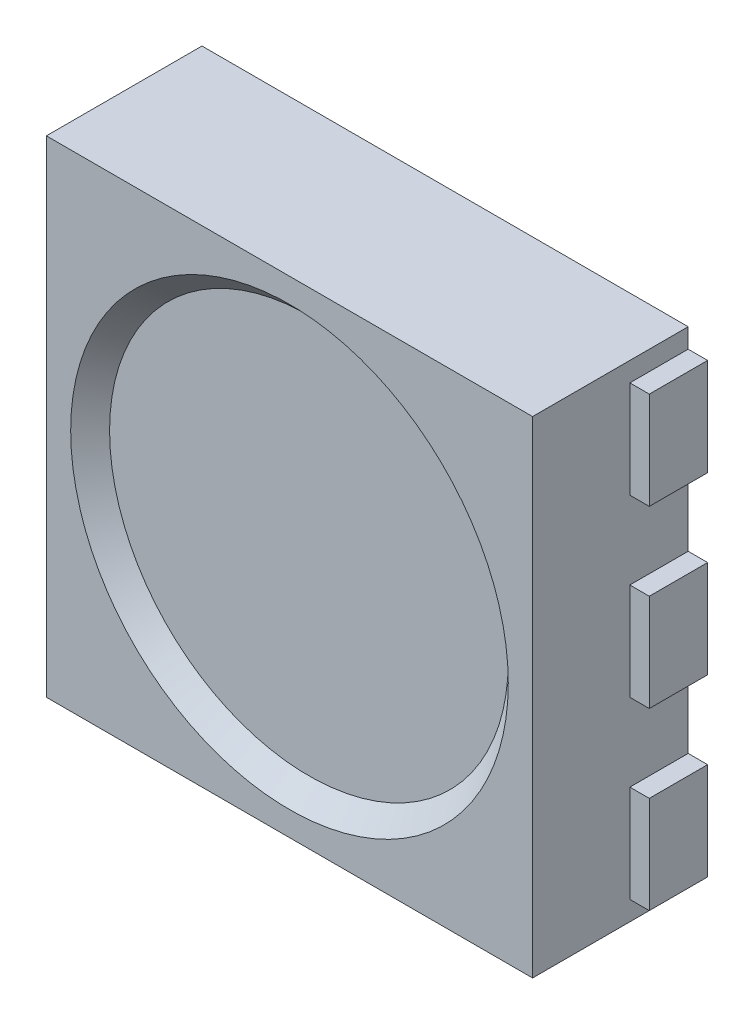
ISO-10303-21;
HEADER;
FILE_DESCRIPTION(('STEP AP214'),'2;1');
FILE_NAME('part.step','',(''),(''),'','','');
FILE_SCHEMA(('AUTOMOTIVE_DESIGN { 1 0 10303 214 1 1 1 1 }'));
ENDSEC;
DATA;
#1=APPLICATION_CONTEXT('core data for automotive mechanical design processes');
#2=APPLICATION_PROTOCOL_DEFINITION('international standard','automotive_design',2000,#1);
#3=PRODUCT_CONTEXT('',#1,'mechanical');
#4=PRODUCT('Part','Part','',(#3));
#5=PRODUCT_RELATED_PRODUCT_CATEGORY('part','',(#4));
#6=PRODUCT_DEFINITION_FORMATION('','',#4);
#7=PRODUCT_DEFINITION_CONTEXT('part definition',#1,'design');
#8=PRODUCT_DEFINITION('design','',#6,#7);
#9=PRODUCT_DEFINITION_SHAPE('','',#8);
#10=(LENGTH_UNIT() NAMED_UNIT(*) SI_UNIT(.MILLI.,.METRE.));
#11=(NAMED_UNIT(*) PLANE_ANGLE_UNIT() SI_UNIT($,.RADIAN.));
#12=(NAMED_UNIT(*) SI_UNIT($,.STERADIAN.) SOLID_ANGLE_UNIT());
#13=UNCERTAINTY_MEASURE_WITH_UNIT(LENGTH_MEASURE(1.E-05),#10,'distance_accuracy_value','');
#14=(GEOMETRIC_REPRESENTATION_CONTEXT(3) GLOBAL_UNCERTAINTY_ASSIGNED_CONTEXT((#13)) GLOBAL_UNIT_ASSIGNED_CONTEXT((#10,
#11,#12)) REPRESENTATION_CONTEXT('',''));
#15=CARTESIAN_POINT('',(0.,0.,0.));
#16=DIRECTION('',(0.,0.,1.));
#17=DIRECTION('',(1.,0.,0.));
#18=AXIS2_PLACEMENT_3D('',#15,#16,#17);
#19=CARTESIAN_POINT('',(2.5,2.5,1.6));
#20=DIRECTION('',(-1.,0.,0.));
#21=DIRECTION('',(0.,-1.,0.));
#22=AXIS2_PLACEMENT_3D('',#19,#20,#21);
#23=PLANE('',#22);
#24=DIRECTION('',(0.,0.,-1.));
#25=VECTOR('',#24,1.);
#26=CARTESIAN_POINT('',(2.5,0.5,0.6));
#27=LINE('',#26,#25);
#28=CARTESIAN_POINT('',(2.5,0.5,0.6));
#29=VERTEX_POINT('',#28);
#30=CARTESIAN_POINT('',(2.5,0.5,0.));
#31=VERTEX_POINT('',#30);
#32=EDGE_CURVE('E247',#29,#31,#27,.T.);
#33=ORIENTED_EDGE('',*,*,#32,.T.);
#34=DIRECTION('',(0.,1.,0.));
#35=VECTOR('',#34,1.);
#36=CARTESIAN_POINT('',(2.5,2.5,0.));
#37=LINE('',#36,#35);
#38=CARTESIAN_POINT('',(2.5,1.3,0.));
#39=VERTEX_POINT('',#38);
#40=EDGE_CURVE('E413',#31,#39,#37,.T.);
#41=ORIENTED_EDGE('',*,*,#40,.T.);
#42=DIRECTION('',(0.,0.,-1.));
#43=VECTOR('',#42,1.);
#44=CARTESIAN_POINT('',(2.5,1.3,0.6));
#45=LINE('',#44,#43);
#46=CARTESIAN_POINT('',(2.5,1.3,0.6));
#47=VERTEX_POINT('',#46);
#48=EDGE_CURVE('E358',#47,#39,#45,.T.);
#49=ORIENTED_EDGE('',*,*,#48,.F.);
#50=DIRECTION('',(0.,-1.,0.));
#51=VECTOR('',#50,1.);
#52=CARTESIAN_POINT('',(2.5,2.3,0.6));
#53=LINE('',#52,#51);
#54=CARTESIAN_POINT('',(2.5,2.3,0.6));
#55=VERTEX_POINT('',#54);
#56=EDGE_CURVE('E341',#55,#47,#53,.T.);
#57=ORIENTED_EDGE('',*,*,#56,.F.);
#58=DIRECTION('',(0.,0.,-1.));
#59=VECTOR('',#58,1.);
#60=CARTESIAN_POINT('',(2.5,2.3,0.6));
#61=LINE('',#60,#59);
#62=CARTESIAN_POINT('',(2.5,2.3,0.));
#63=VERTEX_POINT('',#62);
#64=EDGE_CURVE('E361',#55,#63,#61,.T.);
#65=ORIENTED_EDGE('',*,*,#64,.T.);
#66=CARTESIAN_POINT('',(2.5,2.5,0.));
#67=VERTEX_POINT('',#66);
#68=EDGE_CURVE('E397',#63,#67,#37,.T.);
#69=ORIENTED_EDGE('',*,*,#68,.T.);
#70=DIRECTION('',(0.,0.,-1.));
#71=VECTOR('',#70,1.);
#72=CARTESIAN_POINT('',(2.5,2.5,1.6));
#73=LINE('',#72,#71);
#74=CARTESIAN_POINT('',(2.5,2.5,1.6));
#75=VERTEX_POINT('',#74);
#76=EDGE_CURVE('E11',#75,#67,#73,.T.);
#77=ORIENTED_EDGE('',*,*,#76,.F.);
#78=DIRECTION('',(0.,1.,0.));
#79=VECTOR('',#78,1.);
#80=CARTESIAN_POINT('',(2.5,2.5,1.6));
#81=LINE('',#80,#79);
#82=CARTESIAN_POINT('',(2.5,-2.5,1.6));
#83=VERTEX_POINT('',#82);
#84=EDGE_CURVE('E398',#83,#75,#81,.T.);
#85=ORIENTED_EDGE('',*,*,#84,.F.);
#86=DIRECTION('',(0.,0.,-1.));
#87=VECTOR('',#86,1.);
#88=CARTESIAN_POINT('',(2.5,-2.5,1.6));
#89=LINE('',#88,#87);
#90=CARTESIAN_POINT('',(2.5,-2.5,0.));
#91=VERTEX_POINT('',#90);
#92=EDGE_CURVE('E408',#83,#91,#89,.T.);
#93=ORIENTED_EDGE('',*,*,#92,.T.);
#94=CARTESIAN_POINT('',(2.5,-2.3,0.));
#95=VERTEX_POINT('',#94);
#96=EDGE_CURVE('E409',#91,#95,#37,.T.);
#97=ORIENTED_EDGE('',*,*,#96,.T.);
#98=DIRECTION('',(0.,0.,-1.));
#99=VECTOR('',#98,1.);
#100=CARTESIAN_POINT('',(2.5,-2.3,0.6));
#101=LINE('',#100,#99);
#102=CARTESIAN_POINT('',(2.5,-2.3,0.6));
#103=VERTEX_POINT('',#102);
#104=EDGE_CURVE('E335',#103,#95,#101,.T.);
#105=ORIENTED_EDGE('',*,*,#104,.F.);
#106=DIRECTION('',(0.,-1.,0.));
#107=VECTOR('',#106,1.);
#108=CARTESIAN_POINT('',(2.5,-2.3,0.6));
#109=LINE('',#108,#107);
#110=CARTESIAN_POINT('',(2.5,-1.3,0.6));
#111=VERTEX_POINT('',#110);
#112=EDGE_CURVE('E310',#111,#103,#109,.T.);
#113=ORIENTED_EDGE('',*,*,#112,.F.);
#114=DIRECTION('',(0.,0.,-1.));
#115=VECTOR('',#114,1.);
#116=CARTESIAN_POINT('',(2.5,-1.3,0.6));
#117=LINE('',#116,#115);
#118=CARTESIAN_POINT('',(2.5,-1.3,0.));
#119=VERTEX_POINT('',#118);
#120=EDGE_CURVE('E321',#111,#119,#117,.T.);
#121=ORIENTED_EDGE('',*,*,#120,.T.);
#122=CARTESIAN_POINT('',(2.5,-0.5,0.));
#123=VERTEX_POINT('',#122);
#124=EDGE_CURVE('E412',#119,#123,#37,.T.);
#125=ORIENTED_EDGE('',*,*,#124,.T.);
#126=DIRECTION('',(0.,0.,-1.));
#127=VECTOR('',#126,1.);
#128=CARTESIAN_POINT('',(2.5,-0.5,0.6));
#129=LINE('',#128,#127);
#130=CARTESIAN_POINT('',(2.5,-0.5,0.6));
#131=VERTEX_POINT('',#130);
#132=EDGE_CURVE('E52',#131,#123,#129,.T.);
#133=ORIENTED_EDGE('',*,*,#132,.F.);
#134=DIRECTION('',(0.,-1.,0.));
#135=VECTOR('',#134,1.);
#136=CARTESIAN_POINT('',(2.5,0.5,0.6));
#137=LINE('',#136,#135);
#138=EDGE_CURVE('E47',#29,#131,#137,.T.);
#139=ORIENTED_EDGE('',*,*,#138,.F.);
#140=EDGE_LOOP('',(#33,#41,#49,#57,#65,#69,#77,#85,#93,#97,#105,#113,#121,#125,#133,#139));
#141=FACE_BOUND('',#140,.T.);
#142=ADVANCED_FACE('F33',(#141),#23,.F.);
#143=CARTESIAN_POINT('',(-2.5,2.5,1.6));
#144=DIRECTION('',(1.,0.,0.));
#145=DIRECTION('',(0.,1.,0.));
#146=AXIS2_PLACEMENT_3D('',#143,#144,#145);
#147=PLANE('',#146);
#148=DIRECTION('',(0.,0.,-1.));
#149=VECTOR('',#148,1.);
#150=CARTESIAN_POINT('',(-2.5,-0.5,0.6));
#151=LINE('',#150,#149);
#152=CARTESIAN_POINT('',(-2.5,-0.5,0.6));
#153=VERTEX_POINT('',#152);
#154=CARTESIAN_POINT('',(-2.5,-0.5,0.));
#155=VERTEX_POINT('',#154);
#156=EDGE_CURVE('E274',#153,#155,#151,.T.);
#157=ORIENTED_EDGE('',*,*,#156,.T.);
#158=DIRECTION('',(0.,-1.,0.));
#159=VECTOR('',#158,1.);
#160=CARTESIAN_POINT('',(-2.5,2.5,0.));
#161=LINE('',#160,#159);
#162=CARTESIAN_POINT('',(-2.5,-1.3,0.));
#163=VERTEX_POINT('',#162);
#164=EDGE_CURVE('E420',#155,#163,#161,.T.);
#165=ORIENTED_EDGE('',*,*,#164,.T.);
#166=DIRECTION('',(0.,0.,-1.));
#167=VECTOR('',#166,1.);
#168=CARTESIAN_POINT('',(-2.5,-1.3,0.6));
#169=LINE('',#168,#167);
#170=CARTESIAN_POINT('',(-2.5,-1.3,0.6));
#171=VERTEX_POINT('',#170);
#172=EDGE_CURVE('E303',#171,#163,#169,.T.);
#173=ORIENTED_EDGE('',*,*,#172,.F.);
#174=DIRECTION('',(0.,1.,0.));
#175=VECTOR('',#174,1.);
#176=CARTESIAN_POINT('',(-2.5,-2.3,0.6));
#177=LINE('',#176,#175);
#178=CARTESIAN_POINT('',(-2.5,-2.3,0.6));
#179=VERTEX_POINT('',#178);
#180=EDGE_CURVE('E284',#179,#171,#177,.T.);
#181=ORIENTED_EDGE('',*,*,#180,.F.);
#182=DIRECTION('',(0.,0.,-1.));
#183=VECTOR('',#182,1.);
#184=CARTESIAN_POINT('',(-2.5,-2.3,0.6));
#185=LINE('',#184,#183);
#186=CARTESIAN_POINT('',(-2.5,-2.3,0.));
#187=VERTEX_POINT('',#186);
#188=EDGE_CURVE('E306',#179,#187,#185,.T.);
#189=ORIENTED_EDGE('',*,*,#188,.T.);
#190=CARTESIAN_POINT('',(-2.5,-2.5,0.));
#191=VERTEX_POINT('',#190);
#192=EDGE_CURVE('E415',#187,#191,#161,.T.);
#193=ORIENTED_EDGE('',*,*,#192,.T.);
#194=DIRECTION('',(0.,0.,-1.));
#195=VECTOR('',#194,1.);
#196=CARTESIAN_POINT('',(-2.5,-2.5,1.6));
#197=LINE('',#196,#195);
#198=CARTESIAN_POINT('',(-2.5,-2.5,1.6));
#199=VERTEX_POINT('',#198);
#200=EDGE_CURVE('E424',#199,#191,#197,.T.);
#201=ORIENTED_EDGE('',*,*,#200,.F.);
#202=DIRECTION('',(0.,-1.,0.));
#203=VECTOR('',#202,1.);
#204=CARTESIAN_POINT('',(-2.5,2.5,1.6));
#205=LINE('',#204,#203);
#206=CARTESIAN_POINT('',(-2.5,2.5,1.6));
#207=VERTEX_POINT('',#206);
#208=EDGE_CURVE('E404',#207,#199,#205,.T.);
#209=ORIENTED_EDGE('',*,*,#208,.F.);
#210=DIRECTION('',(0.,0.,-1.));
#211=VECTOR('',#210,1.);
#212=CARTESIAN_POINT('',(-2.5,2.5,1.6));
#213=LINE('',#212,#211);
#214=CARTESIAN_POINT('',(-2.5,2.5,0.));
#215=VERTEX_POINT('',#214);
#216=EDGE_CURVE('E40',#207,#215,#213,.T.);
#217=ORIENTED_EDGE('',*,*,#216,.T.);
#218=CARTESIAN_POINT('',(-2.5,2.3,0.));
#219=VERTEX_POINT('',#218);
#220=EDGE_CURVE('E416',#215,#219,#161,.T.);
#221=ORIENTED_EDGE('',*,*,#220,.T.);
#222=DIRECTION('',(0.,0.,-1.));
#223=VECTOR('',#222,1.);
#224=CARTESIAN_POINT('',(-2.5,2.3,0.6));
#225=LINE('',#224,#223);
#226=CARTESIAN_POINT('',(-2.5,2.3,0.6));
#227=VERTEX_POINT('',#226);
#228=EDGE_CURVE('E388',#227,#219,#225,.T.);
#229=ORIENTED_EDGE('',*,*,#228,.F.);
#230=DIRECTION('',(0.,1.,0.));
#231=VECTOR('',#230,1.);
#232=CARTESIAN_POINT('',(-2.5,2.3,0.6));
#233=LINE('',#232,#231);
#234=CARTESIAN_POINT('',(-2.5,1.3,0.6));
#235=VERTEX_POINT('',#234);
#236=EDGE_CURVE('E365',#235,#227,#233,.T.);
#237=ORIENTED_EDGE('',*,*,#236,.F.);
#238=DIRECTION('',(0.,0.,-1.));
#239=VECTOR('',#238,1.);
#240=CARTESIAN_POINT('',(-2.5,1.3,0.6));
#241=LINE('',#240,#239);
#242=CARTESIAN_POINT('',(-2.5,1.3,0.));
#243=VERTEX_POINT('',#242);
#244=EDGE_CURVE('E375',#235,#243,#241,.T.);
#245=ORIENTED_EDGE('',*,*,#244,.T.);
#246=CARTESIAN_POINT('',(-2.5,0.5,0.));
#247=VERTEX_POINT('',#246);
#248=EDGE_CURVE('E419',#243,#247,#161,.T.);
#249=ORIENTED_EDGE('',*,*,#248,.T.);
#250=DIRECTION('',(0.,0.,-1.));
#251=VECTOR('',#250,1.);
#252=CARTESIAN_POINT('',(-2.5,0.5,0.6));
#253=LINE('',#252,#251);
#254=CARTESIAN_POINT('',(-2.5,0.5,0.6));
#255=VERTEX_POINT('',#254);
#256=EDGE_CURVE('E271',#255,#247,#253,.T.);
#257=ORIENTED_EDGE('',*,*,#256,.F.);
#258=DIRECTION('',(0.,1.,0.));
#259=VECTOR('',#258,1.);
#260=CARTESIAN_POINT('',(-2.5,0.5,0.6));
#261=LINE('',#260,#259);
#262=EDGE_CURVE('E257',#153,#255,#261,.T.);
#263=ORIENTED_EDGE('',*,*,#262,.F.);
#264=EDGE_LOOP('',(#157,#165,#173,#181,#189,#193,#201,#209,#217,#221,#229,#237,#245,#249,#257,#263));
#265=FACE_BOUND('',#264,.T.);
#266=ADVANCED_FACE('F431',(#265),#147,.F.);
#267=CARTESIAN_POINT('',(-2.5,2.5,1.6));
#268=DIRECTION('',(0.,-1.,0.));
#269=DIRECTION('',(0.,0.,-1.));
#270=AXIS2_PLACEMENT_3D('',#267,#268,#269);
#271=PLANE('',#270);
#272=DIRECTION('',(-1.,0.,0.));
#273=VECTOR('',#272,1.);
#274=CARTESIAN_POINT('',(-2.5,2.5,0.));
#275=LINE('',#274,#273);
#276=EDGE_CURVE('E411',#67,#215,#275,.T.);
#277=ORIENTED_EDGE('',*,*,#276,.T.);
#278=ORIENTED_EDGE('',*,*,#216,.F.);
#279=DIRECTION('',(-1.,0.,0.));
#280=VECTOR('',#279,1.);
#281=CARTESIAN_POINT('',(-2.5,2.5,1.6));
#282=LINE('',#281,#280);
#283=EDGE_CURVE('E401',#75,#207,#282,.T.);
#284=ORIENTED_EDGE('',*,*,#283,.F.);
#285=ORIENTED_EDGE('',*,*,#76,.T.);
#286=EDGE_LOOP('',(#277,#278,#284,#285));
#287=FACE_BOUND('',#286,.T.);
#288=ADVANCED_FACE('F471',(#287),#271,.F.);
#289=CARTESIAN_POINT('',(-2.5,-2.5,1.6));
#290=DIRECTION('',(0.,1.,0.));
#291=DIRECTION('',(0.,0.,1.));
#292=AXIS2_PLACEMENT_3D('',#289,#290,#291);
#293=PLANE('',#292);
#294=DIRECTION('',(1.,0.,0.));
#295=VECTOR('',#294,1.);
#296=CARTESIAN_POINT('',(-2.5,-2.5,0.));
#297=LINE('',#296,#295);
#298=EDGE_CURVE('E402',#191,#91,#297,.T.);
#299=ORIENTED_EDGE('',*,*,#298,.T.);
#300=ORIENTED_EDGE('',*,*,#92,.F.);
#301=DIRECTION('',(1.,0.,0.));
#302=VECTOR('',#301,1.);
#303=CARTESIAN_POINT('',(-2.5,-2.5,1.6));
#304=LINE('',#303,#302);
#305=EDGE_CURVE('E406',#199,#83,#304,.T.);
#306=ORIENTED_EDGE('',*,*,#305,.F.);
#307=ORIENTED_EDGE('',*,*,#200,.T.);
#308=EDGE_LOOP('',(#299,#300,#306,#307));
#309=FACE_BOUND('',#308,.T.);
#310=ADVANCED_FACE('F462',(#309),#293,.F.);
#311=CARTESIAN_POINT('',(0.,0.,1.6));
#312=DIRECTION('',(0.,0.,1.));
#313=DIRECTION('',(1.,0.,0.));
#314=AXIS2_PLACEMENT_3D('',#311,#312,#313);
#315=PLANE('',#314);
#316=CARTESIAN_POINT('',(0.,0.,1.6));
#317=DIRECTION('',(0.,0.,1.));
#318=DIRECTION('',(1.,0.,0.));
#319=AXIS2_PLACEMENT_3D('',#316,#317,#318);
#320=CIRCLE('',#319,2.25);
#321=CARTESIAN_POINT('',(2.25,0.,1.6));
#322=VERTEX_POINT('',#321);
#323=EDGE_CURVE('E391',#322,#322,#320,.T.);
#324=ORIENTED_EDGE('',*,*,#323,.F.);
#325=EDGE_LOOP('',(#324));
#326=FACE_BOUND('',#325,.T.);
#327=ORIENTED_EDGE('',*,*,#84,.T.);
#328=ORIENTED_EDGE('',*,*,#283,.T.);
#329=ORIENTED_EDGE('',*,*,#208,.T.);
#330=ORIENTED_EDGE('',*,*,#305,.T.);
#331=EDGE_LOOP('',(#327,#328,#329,#330));
#332=FACE_BOUND('',#331,.T.);
#333=ADVANCED_FACE('F470',(#326,#332),#315,.T.);
#334=CARTESIAN_POINT('',(0.,0.,0.));
#335=DIRECTION('',(0.,0.,1.));
#336=DIRECTION('',(1.,0.,0.));
#337=AXIS2_PLACEMENT_3D('',#334,#335,#336);
#338=PLANE('',#337);
#339=ORIENTED_EDGE('',*,*,#96,.F.);
#340=ORIENTED_EDGE('',*,*,#298,.F.);
#341=ORIENTED_EDGE('',*,*,#192,.F.);
#342=DIRECTION('',(1.,0.,0.));
#343=VECTOR('',#342,1.);
#344=CARTESIAN_POINT('',(-2.5,-2.3,0.));
#345=LINE('',#344,#343);
#346=CARTESIAN_POINT('',(-2.7,-2.3,0.));
#347=VERTEX_POINT('',#346);
#348=EDGE_CURVE('E280',#347,#187,#345,.T.);
#349=ORIENTED_EDGE('',*,*,#348,.F.);
#350=DIRECTION('',(0.,-1.,0.));
#351=VECTOR('',#350,1.);
#352=CARTESIAN_POINT('',(-2.7,-2.3,0.));
#353=LINE('',#352,#351);
#354=CARTESIAN_POINT('',(-2.7,-1.3,0.));
#355=VERTEX_POINT('',#354);
#356=EDGE_CURVE('E285',#355,#347,#353,.T.);
#357=ORIENTED_EDGE('',*,*,#356,.F.);
#358=DIRECTION('',(-1.,0.,0.));
#359=VECTOR('',#358,1.);
#360=CARTESIAN_POINT('',(-2.5,-1.3,0.));
#361=LINE('',#360,#359);
#362=EDGE_CURVE('E295',#163,#355,#361,.T.);
#363=ORIENTED_EDGE('',*,*,#362,.F.);
#364=ORIENTED_EDGE('',*,*,#164,.F.);
#365=DIRECTION('',(1.,0.,0.));
#366=VECTOR('',#365,1.);
#367=CARTESIAN_POINT('',(-2.7,-0.5,0.));
#368=LINE('',#367,#366);
#369=CARTESIAN_POINT('',(-2.7,-0.5,0.));
#370=VERTEX_POINT('',#369);
#371=EDGE_CURVE('E265',#370,#155,#368,.T.);
#372=ORIENTED_EDGE('',*,*,#371,.F.);
#373=DIRECTION('',(0.,-1.,0.));
#374=VECTOR('',#373,1.);
#375=CARTESIAN_POINT('',(-2.7,0.5,0.));
#376=LINE('',#375,#374);
#377=CARTESIAN_POINT('',(-2.7,0.5,0.));
#378=VERTEX_POINT('',#377);
#379=EDGE_CURVE('E249',#378,#370,#376,.T.);
#380=ORIENTED_EDGE('',*,*,#379,.F.);
#381=DIRECTION('',(-1.,0.,0.));
#382=VECTOR('',#381,1.);
#383=CARTESIAN_POINT('',(-2.7,0.5,0.));
#384=LINE('',#383,#382);
#385=EDGE_CURVE('E254',#247,#378,#384,.T.);
#386=ORIENTED_EDGE('',*,*,#385,.F.);
#387=ORIENTED_EDGE('',*,*,#248,.F.);
#388=DIRECTION('',(1.,0.,0.));
#389=VECTOR('',#388,1.);
#390=CARTESIAN_POINT('',(-2.5,1.3,0.));
#391=LINE('',#390,#389);
#392=CARTESIAN_POINT('',(-2.7,1.3,0.));
#393=VERTEX_POINT('',#392);
#394=EDGE_CURVE('E369',#393,#243,#391,.T.);
#395=ORIENTED_EDGE('',*,*,#394,.F.);
#396=DIRECTION('',(0.,-1.,0.));
#397=VECTOR('',#396,1.);
#398=CARTESIAN_POINT('',(-2.7,2.3,0.));
#399=LINE('',#398,#397);
#400=CARTESIAN_POINT('',(-2.7,2.3,0.));
#401=VERTEX_POINT('',#400);
#402=EDGE_CURVE('E377',#401,#393,#399,.T.);
#403=ORIENTED_EDGE('',*,*,#402,.F.);
#404=DIRECTION('',(-1.,0.,0.));
#405=VECTOR('',#404,1.);
#406=CARTESIAN_POINT('',(-2.5,2.3,0.));
#407=LINE('',#406,#405);
#408=EDGE_CURVE('E364',#219,#401,#407,.T.);
#409=ORIENTED_EDGE('',*,*,#408,.F.);
#410=ORIENTED_EDGE('',*,*,#220,.F.);
#411=ORIENTED_EDGE('',*,*,#276,.F.);
#412=ORIENTED_EDGE('',*,*,#68,.F.);
#413=DIRECTION('',(-1.,0.,0.));
#414=VECTOR('',#413,1.);
#415=CARTESIAN_POINT('',(2.5,2.3,0.));
#416=LINE('',#415,#414);
#417=CARTESIAN_POINT('',(2.7,2.3,0.));
#418=VERTEX_POINT('',#417);
#419=EDGE_CURVE('E338',#418,#63,#416,.T.);
#420=ORIENTED_EDGE('',*,*,#419,.F.);
#421=DIRECTION('',(0.,1.,0.));
#422=VECTOR('',#421,1.);
#423=CARTESIAN_POINT('',(2.7,2.3,0.));
#424=LINE('',#423,#422);
#425=CARTESIAN_POINT('',(2.7,1.3,0.));
#426=VERTEX_POINT('',#425);
#427=EDGE_CURVE('E342',#426,#418,#424,.T.);
#428=ORIENTED_EDGE('',*,*,#427,.F.);
#429=DIRECTION('',(1.,0.,0.));
#430=VECTOR('',#429,1.);
#431=CARTESIAN_POINT('',(2.5,1.3,0.));
#432=LINE('',#431,#430);
#433=EDGE_CURVE('E350',#39,#426,#432,.T.);
#434=ORIENTED_EDGE('',*,*,#433,.F.);
#435=ORIENTED_EDGE('',*,*,#40,.F.);
#436=DIRECTION('',(-1.,0.,0.));
#437=VECTOR('',#436,1.);
#438=CARTESIAN_POINT('',(2.7,0.5,0.));
#439=LINE('',#438,#437);
#440=CARTESIAN_POINT('',(2.7,0.5,0.));
#441=VERTEX_POINT('',#440);
#442=EDGE_CURVE('E239',#441,#31,#439,.T.);
#443=ORIENTED_EDGE('',*,*,#442,.F.);
#444=DIRECTION('',(0.,1.,0.));
#445=VECTOR('',#444,1.);
#446=CARTESIAN_POINT('',(2.7,0.5,0.));
#447=LINE('',#446,#445);
#448=CARTESIAN_POINT('',(2.7,-0.5,0.));
#449=VERTEX_POINT('',#448);
#450=EDGE_CURVE('E243',#449,#441,#447,.T.);
#451=ORIENTED_EDGE('',*,*,#450,.F.);
#452=DIRECTION('',(1.,0.,0.));
#453=VECTOR('',#452,1.);
#454=CARTESIAN_POINT('',(2.7,-0.5,0.));
#455=LINE('',#454,#453);
#456=EDGE_CURVE('E227',#123,#449,#455,.T.);
#457=ORIENTED_EDGE('',*,*,#456,.F.);
#458=ORIENTED_EDGE('',*,*,#124,.F.);
#459=DIRECTION('',(-1.,0.,0.));
#460=VECTOR('',#459,1.);
#461=CARTESIAN_POINT('',(2.5,-1.3,0.));
#462=LINE('',#461,#460);
#463=CARTESIAN_POINT('',(2.7,-1.3,0.));
#464=VERTEX_POINT('',#463);
#465=EDGE_CURVE('E314',#464,#119,#462,.T.);
#466=ORIENTED_EDGE('',*,*,#465,.F.);
#467=DIRECTION('',(0.,1.,0.));
#468=VECTOR('',#467,1.);
#469=CARTESIAN_POINT('',(2.7,-2.3,0.));
#470=LINE('',#469,#468);
#471=CARTESIAN_POINT('',(2.7,-2.3,0.));
#472=VERTEX_POINT('',#471);
#473=EDGE_CURVE('E323',#472,#464,#470,.T.);
#474=ORIENTED_EDGE('',*,*,#473,.F.);
#475=DIRECTION('',(1.,0.,0.));
#476=VECTOR('',#475,1.);
#477=CARTESIAN_POINT('',(2.5,-2.3,0.));
#478=LINE('',#477,#476);
#479=EDGE_CURVE('E309',#95,#472,#478,.T.);
#480=ORIENTED_EDGE('',*,*,#479,.F.);
#481=EDGE_LOOP('',(#339,#340,#341,#349,#357,#363,#364,#372,#380,#386,#387,#395,#403,#409,#410,
#411,#412,#420,#428,#434,#435,#443,#451,#457,#458,#466,#474,#480));
#482=FACE_BOUND('',#481,.T.);
#483=ADVANCED_FACE('F438',(#482),#338,.F.);
#484=CARTESIAN_POINT('',(0.,0.,1.6));
#485=DIRECTION('',(0.,0.,1.));
#486=DIRECTION('',(1.,0.,0.));
#487=AXIS2_PLACEMENT_3D('',#484,#485,#486);
#488=CONICAL_SURFACE('',#487,2.25,0.785398163397449);
#489=CARTESIAN_POINT('',(0.,0.,1.4));
#490=DIRECTION('',(0.,0.,1.));
#491=DIRECTION('',(1.,0.,0.));
#492=AXIS2_PLACEMENT_3D('',#489,#490,#491);
#493=CIRCLE('',#492,2.05);
#494=CARTESIAN_POINT('',(2.05,0.,1.4));
#495=VERTEX_POINT('',#494);
#496=EDGE_CURVE('E394',#495,#495,#493,.T.);
#497=ORIENTED_EDGE('',*,*,#496,.F.);
#498=EDGE_LOOP('',(#497));
#499=FACE_BOUND('',#498,.T.);
#500=ORIENTED_EDGE('',*,*,#323,.T.);
#501=EDGE_LOOP('',(#500));
#502=FACE_BOUND('',#501,.T.);
#503=ADVANCED_FACE('F497',(#499,#502),#488,.F.);
#504=CARTESIAN_POINT('',(0.,0.,1.4));
#505=DIRECTION('',(0.,0.,1.));
#506=DIRECTION('',(1.,0.,0.));
#507=AXIS2_PLACEMENT_3D('',#504,#505,#506);
#508=PLANE('',#507);
#509=ORIENTED_EDGE('',*,*,#496,.T.);
#510=EDGE_LOOP('',(#509));
#511=FACE_BOUND('',#510,.T.);
#512=ADVANCED_FACE('F510',(#511),#508,.T.);
#513=CARTESIAN_POINT('',(-2.5,2.3,0.6));
#514=DIRECTION('',(0.,-1.,0.));
#515=DIRECTION('',(1.,0.,0.));
#516=AXIS2_PLACEMENT_3D('',#513,#514,#515);
#517=PLANE('',#516);
#518=ORIENTED_EDGE('',*,*,#408,.T.);
#519=DIRECTION('',(0.,0.,-1.));
#520=VECTOR('',#519,1.);
#521=CARTESIAN_POINT('',(-2.7,2.3,0.6));
#522=LINE('',#521,#520);
#523=CARTESIAN_POINT('',(-2.7,2.3,0.6));
#524=VERTEX_POINT('',#523);
#525=EDGE_CURVE('E385',#524,#401,#522,.T.);
#526=ORIENTED_EDGE('',*,*,#525,.F.);
#527=DIRECTION('',(-1.,0.,0.));
#528=VECTOR('',#527,1.);
#529=CARTESIAN_POINT('',(-2.5,2.3,0.6));
#530=LINE('',#529,#528);
#531=EDGE_CURVE('E368',#227,#524,#530,.T.);
#532=ORIENTED_EDGE('',*,*,#531,.F.);
#533=ORIENTED_EDGE('',*,*,#228,.T.);
#534=EDGE_LOOP('',(#518,#526,#532,#533));
#535=FACE_BOUND('',#534,.T.);
#536=ADVANCED_FACE('F444',(#535),#517,.F.);
#537=CARTESIAN_POINT('',(-2.7,2.3,0.6));
#538=DIRECTION('',(1.,0.,0.));
#539=DIRECTION('',(0.,1.,0.));
#540=AXIS2_PLACEMENT_3D('',#537,#538,#539);
#541=PLANE('',#540);
#542=ORIENTED_EDGE('',*,*,#402,.T.);
#543=DIRECTION('',(0.,0.,-1.));
#544=VECTOR('',#543,1.);
#545=CARTESIAN_POINT('',(-2.7,1.3,0.6));
#546=LINE('',#545,#544);
#547=CARTESIAN_POINT('',(-2.7,1.3,0.6));
#548=VERTEX_POINT('',#547);
#549=EDGE_CURVE('E382',#548,#393,#546,.T.);
#550=ORIENTED_EDGE('',*,*,#549,.F.);
#551=DIRECTION('',(0.,-1.,0.));
#552=VECTOR('',#551,1.);
#553=CARTESIAN_POINT('',(-2.7,2.3,0.6));
#554=LINE('',#553,#552);
#555=EDGE_CURVE('E371',#524,#548,#554,.T.);
#556=ORIENTED_EDGE('',*,*,#555,.F.);
#557=ORIENTED_EDGE('',*,*,#525,.T.);
#558=EDGE_LOOP('',(#542,#550,#556,#557));
#559=FACE_BOUND('',#558,.T.);
#560=ADVANCED_FACE('F509',(#559),#541,.F.);
#561=CARTESIAN_POINT('',(-2.5,1.3,0.6));
#562=DIRECTION('',(0.,1.,0.));
#563=DIRECTION('',(-1.,0.,0.));
#564=AXIS2_PLACEMENT_3D('',#561,#562,#563);
#565=PLANE('',#564);
#566=ORIENTED_EDGE('',*,*,#394,.T.);
#567=ORIENTED_EDGE('',*,*,#244,.F.);
#568=DIRECTION('',(1.,0.,0.));
#569=VECTOR('',#568,1.);
#570=CARTESIAN_POINT('',(-2.5,1.3,0.6));
#571=LINE('',#570,#569);
#572=EDGE_CURVE('E373',#548,#235,#571,.T.);
#573=ORIENTED_EDGE('',*,*,#572,.F.);
#574=ORIENTED_EDGE('',*,*,#549,.T.);
#575=EDGE_LOOP('',(#566,#567,#573,#574));
#576=FACE_BOUND('',#575,.T.);
#577=ADVANCED_FACE('F454',(#576),#565,.F.);
#578=CARTESIAN_POINT('',(0.,0.,0.6));
#579=DIRECTION('',(0.,0.,-1.));
#580=DIRECTION('',(-1.,0.,0.));
#581=AXIS2_PLACEMENT_3D('',#578,#579,#580);
#582=PLANE('',#581);
#583=ORIENTED_EDGE('',*,*,#236,.T.);
#584=ORIENTED_EDGE('',*,*,#531,.T.);
#585=ORIENTED_EDGE('',*,*,#555,.T.);
#586=ORIENTED_EDGE('',*,*,#572,.T.);
#587=EDGE_LOOP('',(#583,#584,#585,#586));
#588=FACE_BOUND('',#587,.T.);
#589=ADVANCED_FACE('F449',(#588),#582,.F.);
#590=CARTESIAN_POINT('',(2.5,2.3,0.6));
#591=DIRECTION('',(0.,-1.,0.));
#592=DIRECTION('',(1.,0.,0.));
#593=AXIS2_PLACEMENT_3D('',#590,#591,#592);
#594=PLANE('',#593);
#595=ORIENTED_EDGE('',*,*,#419,.T.);
#596=ORIENTED_EDGE('',*,*,#64,.F.);
#597=DIRECTION('',(-1.,0.,0.));
#598=VECTOR('',#597,1.);
#599=CARTESIAN_POINT('',(2.5,2.3,0.6));
#600=LINE('',#599,#598);
#601=CARTESIAN_POINT('',(2.7,2.3,0.6));
#602=VERTEX_POINT('',#601);
#603=EDGE_CURVE('E339',#602,#55,#600,.T.);
#604=ORIENTED_EDGE('',*,*,#603,.F.);
#605=DIRECTION('',(0.,0.,-1.));
#606=VECTOR('',#605,1.);
#607=CARTESIAN_POINT('',(2.7,2.3,0.6));
#608=LINE('',#607,#606);
#609=EDGE_CURVE('E348',#602,#418,#608,.T.);
#610=ORIENTED_EDGE('',*,*,#609,.T.);
#611=EDGE_LOOP('',(#595,#596,#604,#610));
#612=FACE_BOUND('',#611,.T.);
#613=ADVANCED_FACE('F537',(#612),#594,.F.);
#614=CARTESIAN_POINT('',(2.5,1.3,0.6));
#615=DIRECTION('',(0.,1.,0.));
#616=DIRECTION('',(-1.,0.,0.));
#617=AXIS2_PLACEMENT_3D('',#614,#615,#616);
#618=PLANE('',#617);
#619=ORIENTED_EDGE('',*,*,#433,.T.);
#620=DIRECTION('',(0.,0.,-1.));
#621=VECTOR('',#620,1.);
#622=CARTESIAN_POINT('',(2.7,1.3,0.6));
#623=LINE('',#622,#621);
#624=CARTESIAN_POINT('',(2.7,1.3,0.6));
#625=VERTEX_POINT('',#624);
#626=EDGE_CURVE('E355',#625,#426,#623,.T.);
#627=ORIENTED_EDGE('',*,*,#626,.F.);
#628=DIRECTION('',(1.,0.,0.));
#629=VECTOR('',#628,1.);
#630=CARTESIAN_POINT('',(2.5,1.3,0.6));
#631=LINE('',#630,#629);
#632=EDGE_CURVE('E344',#47,#625,#631,.T.);
#633=ORIENTED_EDGE('',*,*,#632,.F.);
#634=ORIENTED_EDGE('',*,*,#48,.T.);
#635=EDGE_LOOP('',(#619,#627,#633,#634));
#636=FACE_BOUND('',#635,.T.);
#637=ADVANCED_FACE('F546',(#636),#618,.F.);
#638=CARTESIAN_POINT('',(2.7,2.3,0.6));
#639=DIRECTION('',(-1.,0.,0.));
#640=DIRECTION('',(0.,-1.,0.));
#641=AXIS2_PLACEMENT_3D('',#638,#639,#640);
#642=PLANE('',#641);
#643=ORIENTED_EDGE('',*,*,#427,.T.);
#644=ORIENTED_EDGE('',*,*,#609,.F.);
#645=DIRECTION('',(0.,1.,0.));
#646=VECTOR('',#645,1.);
#647=CARTESIAN_POINT('',(2.7,2.3,0.6));
#648=LINE('',#647,#646);
#649=EDGE_CURVE('E346',#625,#602,#648,.T.);
#650=ORIENTED_EDGE('',*,*,#649,.F.);
#651=ORIENTED_EDGE('',*,*,#626,.T.);
#652=EDGE_LOOP('',(#643,#644,#650,#651));
#653=FACE_BOUND('',#652,.T.);
#654=ADVANCED_FACE('F556',(#653),#642,.F.);
#655=CARTESIAN_POINT('',(0.,0.,0.6));
#656=DIRECTION('',(0.,0.,-1.));
#657=DIRECTION('',(-1.,0.,0.));
#658=AXIS2_PLACEMENT_3D('',#655,#656,#657);
#659=PLANE('',#658);
#660=ORIENTED_EDGE('',*,*,#603,.T.);
#661=ORIENTED_EDGE('',*,*,#56,.T.);
#662=ORIENTED_EDGE('',*,*,#632,.T.);
#663=ORIENTED_EDGE('',*,*,#649,.T.);
#664=EDGE_LOOP('',(#660,#661,#662,#663));
#665=FACE_BOUND('',#664,.T.);
#666=ADVANCED_FACE('F566',(#665),#659,.F.);
#667=CARTESIAN_POINT('',(2.5,-2.3,0.6));
#668=DIRECTION('',(0.,1.,0.));
#669=DIRECTION('',(-1.,0.,0.));
#670=AXIS2_PLACEMENT_3D('',#667,#668,#669);
#671=PLANE('',#670);
#672=ORIENTED_EDGE('',*,*,#479,.T.);
#673=DIRECTION('',(0.,0.,-1.));
#674=VECTOR('',#673,1.);
#675=CARTESIAN_POINT('',(2.7,-2.3,0.6));
#676=LINE('',#675,#674);
#677=CARTESIAN_POINT('',(2.7,-2.3,0.6));
#678=VERTEX_POINT('',#677);
#679=EDGE_CURVE('E332',#678,#472,#676,.T.);
#680=ORIENTED_EDGE('',*,*,#679,.F.);
#681=DIRECTION('',(1.,0.,0.));
#682=VECTOR('',#681,1.);
#683=CARTESIAN_POINT('',(2.5,-2.3,0.6));
#684=LINE('',#683,#682);
#685=EDGE_CURVE('E313',#103,#678,#684,.T.);
#686=ORIENTED_EDGE('',*,*,#685,.F.);
#687=ORIENTED_EDGE('',*,*,#104,.T.);
#688=EDGE_LOOP('',(#672,#680,#686,#687));
#689=FACE_BOUND('',#688,.T.);
#690=ADVANCED_FACE('F576',(#689),#671,.F.);
#691=CARTESIAN_POINT('',(2.7,-2.3,0.6));
#692=DIRECTION('',(-1.,0.,0.));
#693=DIRECTION('',(0.,-1.,0.));
#694=AXIS2_PLACEMENT_3D('',#691,#692,#693);
#695=PLANE('',#694);
#696=ORIENTED_EDGE('',*,*,#473,.T.);
#697=DIRECTION('',(0.,0.,-1.));
#698=VECTOR('',#697,1.);
#699=CARTESIAN_POINT('',(2.7,-1.3,0.6));
#700=LINE('',#699,#698);
#701=CARTESIAN_POINT('',(2.7,-1.3,0.6));
#702=VERTEX_POINT('',#701);
#703=EDGE_CURVE('E329',#702,#464,#700,.T.);
#704=ORIENTED_EDGE('',*,*,#703,.F.);
#705=DIRECTION('',(0.,1.,0.));
#706=VECTOR('',#705,1.);
#707=CARTESIAN_POINT('',(2.7,-2.3,0.6));
#708=LINE('',#707,#706);
#709=EDGE_CURVE('E316',#678,#702,#708,.T.);
#710=ORIENTED_EDGE('',*,*,#709,.F.);
#711=ORIENTED_EDGE('',*,*,#679,.T.);
#712=EDGE_LOOP('',(#696,#704,#710,#711));
#713=FACE_BOUND('',#712,.T.);
#714=ADVANCED_FACE('F586',(#713),#695,.F.);
#715=CARTESIAN_POINT('',(2.5,-1.3,0.6));
#716=DIRECTION('',(0.,-1.,0.));
#717=DIRECTION('',(1.,0.,0.));
#718=AXIS2_PLACEMENT_3D('',#715,#716,#717);
#719=PLANE('',#718);
#720=ORIENTED_EDGE('',*,*,#465,.T.);
#721=ORIENTED_EDGE('',*,*,#120,.F.);
#722=DIRECTION('',(-1.,0.,0.));
#723=VECTOR('',#722,1.);
#724=CARTESIAN_POINT('',(2.5,-1.3,0.6));
#725=LINE('',#724,#723);
#726=EDGE_CURVE('E318',#702,#111,#725,.T.);
#727=ORIENTED_EDGE('',*,*,#726,.F.);
#728=ORIENTED_EDGE('',*,*,#703,.T.);
#729=EDGE_LOOP('',(#720,#721,#727,#728));
#730=FACE_BOUND('',#729,.T.);
#731=ADVANCED_FACE('F596',(#730),#719,.F.);
#732=CARTESIAN_POINT('',(0.,0.,0.6));
#733=DIRECTION('',(0.,0.,-1.));
#734=DIRECTION('',(-1.,0.,0.));
#735=AXIS2_PLACEMENT_3D('',#732,#733,#734);
#736=PLANE('',#735);
#737=ORIENTED_EDGE('',*,*,#112,.T.);
#738=ORIENTED_EDGE('',*,*,#685,.T.);
#739=ORIENTED_EDGE('',*,*,#709,.T.);
#740=ORIENTED_EDGE('',*,*,#726,.T.);
#741=EDGE_LOOP('',(#737,#738,#739,#740));
#742=FACE_BOUND('',#741,.T.);
#743=ADVANCED_FACE('F606',(#742),#736,.F.);
#744=CARTESIAN_POINT('',(-2.5,-2.3,0.6));
#745=DIRECTION('',(0.,1.,0.));
#746=DIRECTION('',(-1.,0.,0.));
#747=AXIS2_PLACEMENT_3D('',#744,#745,#746);
#748=PLANE('',#747);
#749=ORIENTED_EDGE('',*,*,#348,.T.);
#750=ORIENTED_EDGE('',*,*,#188,.F.);
#751=DIRECTION('',(1.,0.,0.));
#752=VECTOR('',#751,1.);
#753=CARTESIAN_POINT('',(-2.5,-2.3,0.6));
#754=LINE('',#753,#752);
#755=CARTESIAN_POINT('',(-2.7,-2.3,0.6));
#756=VERTEX_POINT('',#755);
#757=EDGE_CURVE('E281',#756,#179,#754,.T.);
#758=ORIENTED_EDGE('',*,*,#757,.F.);
#759=DIRECTION('',(0.,0.,-1.));
#760=VECTOR('',#759,1.);
#761=CARTESIAN_POINT('',(-2.7,-2.3,0.6));
#762=LINE('',#761,#760);
#763=EDGE_CURVE('E292',#756,#347,#762,.T.);
#764=ORIENTED_EDGE('',*,*,#763,.T.);
#765=EDGE_LOOP('',(#749,#750,#758,#764));
#766=FACE_BOUND('',#765,.T.);
#767=ADVANCED_FACE('F616',(#766),#748,.F.);
#768=CARTESIAN_POINT('',(-2.5,-1.3,0.6));
#769=DIRECTION('',(0.,-1.,0.));
#770=DIRECTION('',(1.,0.,0.));
#771=AXIS2_PLACEMENT_3D('',#768,#769,#770);
#772=PLANE('',#771);
#773=ORIENTED_EDGE('',*,*,#362,.T.);
#774=DIRECTION('',(0.,0.,-1.));
#775=VECTOR('',#774,1.);
#776=CARTESIAN_POINT('',(-2.7,-1.3,0.6));
#777=LINE('',#776,#775);
#778=CARTESIAN_POINT('',(-2.7,-1.3,0.6));
#779=VERTEX_POINT('',#778);
#780=EDGE_CURVE('E300',#779,#355,#777,.T.);
#781=ORIENTED_EDGE('',*,*,#780,.F.);
#782=DIRECTION('',(-1.,0.,0.));
#783=VECTOR('',#782,1.);
#784=CARTESIAN_POINT('',(-2.5,-1.3,0.6));
#785=LINE('',#784,#783);
#786=EDGE_CURVE('E288',#171,#779,#785,.T.);
#787=ORIENTED_EDGE('',*,*,#786,.F.);
#788=ORIENTED_EDGE('',*,*,#172,.T.);
#789=EDGE_LOOP('',(#773,#781,#787,#788));
#790=FACE_BOUND('',#789,.T.);
#791=ADVANCED_FACE('F626',(#790),#772,.F.);
#792=CARTESIAN_POINT('',(-2.7,-2.3,0.6));
#793=DIRECTION('',(1.,0.,0.));
#794=DIRECTION('',(0.,1.,0.));
#795=AXIS2_PLACEMENT_3D('',#792,#793,#794);
#796=PLANE('',#795);
#797=ORIENTED_EDGE('',*,*,#356,.T.);
#798=ORIENTED_EDGE('',*,*,#763,.F.);
#799=DIRECTION('',(0.,-1.,0.));
#800=VECTOR('',#799,1.);
#801=CARTESIAN_POINT('',(-2.7,-2.3,0.6));
#802=LINE('',#801,#800);
#803=EDGE_CURVE('E290',#779,#756,#802,.T.);
#804=ORIENTED_EDGE('',*,*,#803,.F.);
#805=ORIENTED_EDGE('',*,*,#780,.T.);
#806=EDGE_LOOP('',(#797,#798,#804,#805));
#807=FACE_BOUND('',#806,.T.);
#808=ADVANCED_FACE('F636',(#807),#796,.F.);
#809=CARTESIAN_POINT('',(0.,0.,0.6));
#810=DIRECTION('',(0.,0.,-1.));
#811=DIRECTION('',(-1.,0.,0.));
#812=AXIS2_PLACEMENT_3D('',#809,#810,#811);
#813=PLANE('',#812);
#814=ORIENTED_EDGE('',*,*,#757,.T.);
#815=ORIENTED_EDGE('',*,*,#180,.T.);
#816=ORIENTED_EDGE('',*,*,#786,.T.);
#817=ORIENTED_EDGE('',*,*,#803,.T.);
#818=EDGE_LOOP('',(#814,#815,#816,#817));
#819=FACE_BOUND('',#818,.T.);
#820=ADVANCED_FACE('F646',(#819),#813,.F.);
#821=CARTESIAN_POINT('',(-2.7,0.5,0.6));
#822=DIRECTION('',(1.,0.,0.));
#823=DIRECTION('',(0.,0.,-1.));
#824=AXIS2_PLACEMENT_3D('',#821,#822,#823);
#825=PLANE('',#824);
#826=ORIENTED_EDGE('',*,*,#379,.T.);
#827=DIRECTION('',(0.,0.,-1.));
#828=VECTOR('',#827,1.);
#829=CARTESIAN_POINT('',(-2.7,-0.5,0.6));
#830=LINE('',#829,#828);
#831=CARTESIAN_POINT('',(-2.7,-0.5,0.6));
#832=VERTEX_POINT('',#831);
#833=EDGE_CURVE('E277',#832,#370,#830,.T.);
#834=ORIENTED_EDGE('',*,*,#833,.F.);
#835=DIRECTION('',(0.,-1.,0.));
#836=VECTOR('',#835,1.);
#837=CARTESIAN_POINT('',(-2.7,0.5,0.6));
#838=LINE('',#837,#836);
#839=CARTESIAN_POINT('',(-2.7,0.5,0.6));
#840=VERTEX_POINT('',#839);
#841=EDGE_CURVE('E250',#840,#832,#838,.T.);
#842=ORIENTED_EDGE('',*,*,#841,.F.);
#843=DIRECTION('',(0.,0.,-1.));
#844=VECTOR('',#843,1.);
#845=CARTESIAN_POINT('',(-2.7,0.5,0.6));
#846=LINE('',#845,#844);
#847=EDGE_CURVE('E262',#840,#378,#846,.T.);
#848=ORIENTED_EDGE('',*,*,#847,.T.);
#849=EDGE_LOOP('',(#826,#834,#842,#848));
#850=FACE_BOUND('',#849,.T.);
#851=ADVANCED_FACE('F656',(#850),#825,.F.);
#852=CARTESIAN_POINT('',(-2.7,-0.5,0.6));
#853=DIRECTION('',(0.,1.,0.));
#854=DIRECTION('',(0.,0.,1.));
#855=AXIS2_PLACEMENT_3D('',#852,#853,#854);
#856=PLANE('',#855);
#857=ORIENTED_EDGE('',*,*,#371,.T.);
#858=ORIENTED_EDGE('',*,*,#156,.F.);
#859=DIRECTION('',(1.,0.,0.));
#860=VECTOR('',#859,1.);
#861=CARTESIAN_POINT('',(-2.7,-0.5,0.6));
#862=LINE('',#861,#860);
#863=EDGE_CURVE('E253',#832,#153,#862,.T.);
#864=ORIENTED_EDGE('',*,*,#863,.F.);
#865=ORIENTED_EDGE('',*,*,#833,.T.);
#866=EDGE_LOOP('',(#857,#858,#864,#865));
#867=FACE_BOUND('',#866,.T.);
#868=ADVANCED_FACE('F666',(#867),#856,.F.);
#869=CARTESIAN_POINT('',(-2.7,0.5,0.6));
#870=DIRECTION('',(0.,-1.,0.));
#871=DIRECTION('',(0.,0.,-1.));
#872=AXIS2_PLACEMENT_3D('',#869,#870,#871);
#873=PLANE('',#872);
#874=ORIENTED_EDGE('',*,*,#385,.T.);
#875=ORIENTED_EDGE('',*,*,#847,.F.);
#876=DIRECTION('',(-1.,0.,0.));
#877=VECTOR('',#876,1.);
#878=CARTESIAN_POINT('',(-2.7,0.5,0.6));
#879=LINE('',#878,#877);
#880=EDGE_CURVE('E260',#255,#840,#879,.T.);
#881=ORIENTED_EDGE('',*,*,#880,.F.);
#882=ORIENTED_EDGE('',*,*,#256,.T.);
#883=EDGE_LOOP('',(#874,#875,#881,#882));
#884=FACE_BOUND('',#883,.T.);
#885=ADVANCED_FACE('F676',(#884),#873,.F.);
#886=CARTESIAN_POINT('',(0.,0.,0.6));
#887=DIRECTION('',(0.,0.,1.));
#888=DIRECTION('',(1.,0.,0.));
#889=AXIS2_PLACEMENT_3D('',#886,#887,#888);
#890=PLANE('',#889);
#891=ORIENTED_EDGE('',*,*,#841,.T.);
#892=ORIENTED_EDGE('',*,*,#863,.T.);
#893=ORIENTED_EDGE('',*,*,#262,.T.);
#894=ORIENTED_EDGE('',*,*,#880,.T.);
#895=EDGE_LOOP('',(#891,#892,#893,#894));
#896=FACE_BOUND('',#895,.T.);
#897=ADVANCED_FACE('F686',(#896),#890,.T.);
#898=CARTESIAN_POINT('',(2.7,0.5,0.6));
#899=DIRECTION('',(0.,-1.,0.));
#900=DIRECTION('',(0.,0.,-1.));
#901=AXIS2_PLACEMENT_3D('',#898,#899,#900);
#902=PLANE('',#901);
#903=ORIENTED_EDGE('',*,*,#442,.T.);
#904=ORIENTED_EDGE('',*,*,#32,.F.);
#905=DIRECTION('',(-1.,0.,0.));
#906=VECTOR('',#905,1.);
#907=CARTESIAN_POINT('',(2.7,0.5,0.6));
#908=LINE('',#907,#906);
#909=CARTESIAN_POINT('',(2.7,0.5,0.6));
#910=VERTEX_POINT('',#909);
#911=EDGE_CURVE('E244',#910,#29,#908,.T.);
#912=ORIENTED_EDGE('',*,*,#911,.F.);
#913=DIRECTION('',(0.,0.,-1.));
#914=VECTOR('',#913,1.);
#915=CARTESIAN_POINT('',(2.7,0.5,0.6));
#916=LINE('',#915,#914);
#917=EDGE_CURVE('E230',#910,#441,#916,.T.);
#918=ORIENTED_EDGE('',*,*,#917,.T.);
#919=EDGE_LOOP('',(#903,#904,#912,#918));
#920=FACE_BOUND('',#919,.T.);
#921=ADVANCED_FACE('F696',(#920),#902,.F.);
#922=CARTESIAN_POINT('',(2.7,-0.5,0.6));
#923=DIRECTION('',(0.,1.,0.));
#924=DIRECTION('',(0.,0.,1.));
#925=AXIS2_PLACEMENT_3D('',#922,#923,#924);
#926=PLANE('',#925);
#927=ORIENTED_EDGE('',*,*,#456,.T.);
#928=DIRECTION('',(0.,0.,-1.));
#929=VECTOR('',#928,1.);
#930=CARTESIAN_POINT('',(2.7,-0.5,0.6));
#931=LINE('',#930,#929);
#932=CARTESIAN_POINT('',(2.7,-0.5,0.6));
#933=VERTEX_POINT('',#932);
#934=EDGE_CURVE('E224',#933,#449,#931,.T.);
#935=ORIENTED_EDGE('',*,*,#934,.F.);
#936=DIRECTION('',(1.,0.,0.));
#937=VECTOR('',#936,1.);
#938=CARTESIAN_POINT('',(2.7,-0.5,0.6));
#939=LINE('',#938,#937);
#940=EDGE_CURVE('E215',#131,#933,#939,.T.);
#941=ORIENTED_EDGE('',*,*,#940,.F.);
#942=ORIENTED_EDGE('',*,*,#132,.T.);
#943=EDGE_LOOP('',(#927,#935,#941,#942));
#944=FACE_BOUND('',#943,.T.);
#945=ADVANCED_FACE('F225',(#944),#926,.F.);
#946=CARTESIAN_POINT('',(2.7,0.5,0.6));
#947=DIRECTION('',(-1.,0.,0.));
#948=DIRECTION('',(0.,0.,1.));
#949=AXIS2_PLACEMENT_3D('',#946,#947,#948);
#950=PLANE('',#949);
#951=ORIENTED_EDGE('',*,*,#450,.T.);
#952=ORIENTED_EDGE('',*,*,#917,.F.);
#953=DIRECTION('',(0.,1.,0.));
#954=VECTOR('',#953,1.);
#955=CARTESIAN_POINT('',(2.7,0.5,0.6));
#956=LINE('',#955,#954);
#957=EDGE_CURVE('E219',#933,#910,#956,.T.);
#958=ORIENTED_EDGE('',*,*,#957,.F.);
#959=ORIENTED_EDGE('',*,*,#934,.T.);
#960=EDGE_LOOP('',(#951,#952,#958,#959));
#961=FACE_BOUND('',#960,.T.);
#962=ADVANCED_FACE('F232',(#961),#950,.F.);
#963=CARTESIAN_POINT('',(0.,0.,0.6));
#964=DIRECTION('',(0.,0.,1.));
#965=DIRECTION('',(1.,0.,0.));
#966=AXIS2_PLACEMENT_3D('',#963,#964,#965);
#967=PLANE('',#966);
#968=ORIENTED_EDGE('',*,*,#911,.T.);
#969=ORIENTED_EDGE('',*,*,#138,.T.);
#970=ORIENTED_EDGE('',*,*,#940,.T.);
#971=ORIENTED_EDGE('',*,*,#957,.T.);
#972=EDGE_LOOP('',(#968,#969,#970,#971));
#973=FACE_BOUND('',#972,.T.);
#974=ADVANCED_FACE('F217',(#973),#967,.T.);
#975=CLOSED_SHELL('',(#142,#266,#288,#310,#333,#483,#503,#512,#536,#560,#577,#589,#613,#637,
#654,#666,#690,#714,#731,#743,#767,#791,#808,#820,#851,#868,#885,#897,#921,#945,#962,#974));
#976=MANIFOLD_SOLID_BREP('B2',#975);
#977=ADVANCED_BREP_SHAPE_REPRESENTATION('',(#18,#976),#14);
#978=SHAPE_DEFINITION_REPRESENTATION(#9,#977);
ENDSEC;
END-ISO-10303-21;
